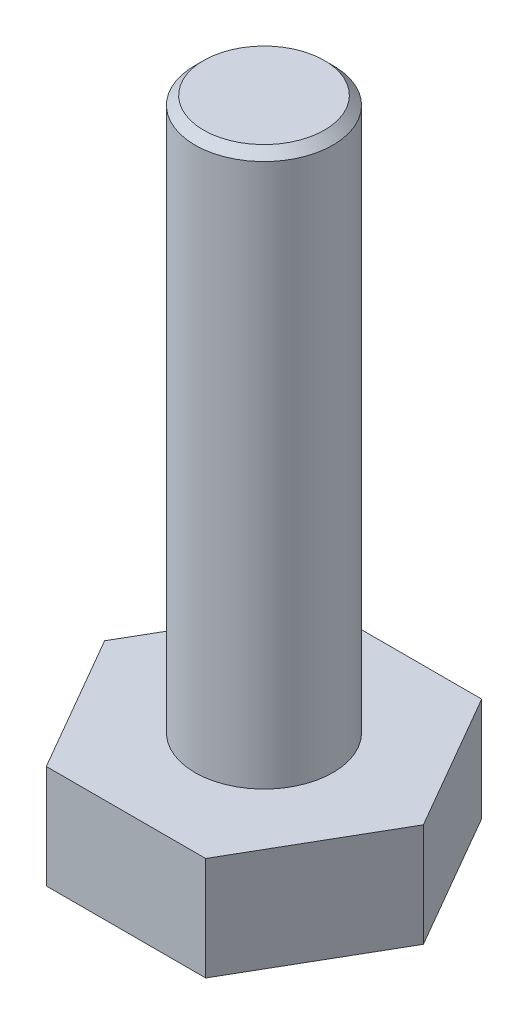
ISO-10303-21;
HEADER;
FILE_DESCRIPTION(('STEP AP214'),'2;1');
FILE_NAME('part.step','',(''),(''),'','','');
FILE_SCHEMA(('AUTOMOTIVE_DESIGN { 1 0 10303 214 1 1 1 1 }'));
ENDSEC;
DATA;
#1=APPLICATION_CONTEXT('core data for automotive mechanical design processes');
#2=APPLICATION_PROTOCOL_DEFINITION('international standard','automotive_design',2000,#1);
#3=PRODUCT_CONTEXT('',#1,'mechanical');
#4=PRODUCT('Part','Part','',(#3));
#5=PRODUCT_RELATED_PRODUCT_CATEGORY('part','',(#4));
#6=PRODUCT_DEFINITION_FORMATION('','',#4);
#7=PRODUCT_DEFINITION_CONTEXT('part definition',#1,'design');
#8=PRODUCT_DEFINITION('design','',#6,#7);
#9=PRODUCT_DEFINITION_SHAPE('','',#8);
#10=(LENGTH_UNIT() NAMED_UNIT(*) SI_UNIT(.MILLI.,.METRE.));
#11=(NAMED_UNIT(*) PLANE_ANGLE_UNIT() SI_UNIT($,.RADIAN.));
#12=(NAMED_UNIT(*) SI_UNIT($,.STERADIAN.) SOLID_ANGLE_UNIT());
#13=UNCERTAINTY_MEASURE_WITH_UNIT(LENGTH_MEASURE(1.E-05),#10,'distance_accuracy_value','');
#14=(GEOMETRIC_REPRESENTATION_CONTEXT(3) GLOBAL_UNCERTAINTY_ASSIGNED_CONTEXT((#13)) GLOBAL_UNIT_ASSIGNED_CONTEXT((#10,
#11,#12)) REPRESENTATION_CONTEXT('',''));
#15=CARTESIAN_POINT('',(0.,0.,0.));
#16=DIRECTION('',(0.,0.,1.));
#17=DIRECTION('',(1.,0.,0.));
#18=AXIS2_PLACEMENT_3D('',#15,#16,#17);
#19=CARTESIAN_POINT('',(2.30940107675854,-3.,3.99999999999996));
#20=DIRECTION('',(0.866025403784441,0.,0.499999999999995));
#21=DIRECTION('',(0.499999999999995,0.,-0.866025403784442));
#22=AXIS2_PLACEMENT_3D('',#19,#20,#21);
#23=PLANE('',#22);
#24=DIRECTION('',(0.499999999999995,0.,-0.866025403784442));
#25=VECTOR('',#24,1.);
#26=CARTESIAN_POINT('',(2.30940107675854,0.,3.99999999999996));
#27=LINE('',#26,#25);
#28=CARTESIAN_POINT('',(2.30940107675854,0.,3.99999999999996));
#29=VERTEX_POINT('',#28);
#30=CARTESIAN_POINT('',(4.61880215351699,0.,0.));
#31=VERTEX_POINT('',#30);
#32=EDGE_CURVE('E120',#29,#31,#27,.T.);
#33=ORIENTED_EDGE('',*,*,#32,.F.);
#34=DIRECTION('',(0.,1.,0.));
#35=VECTOR('',#34,1.);
#36=CARTESIAN_POINT('',(2.30940107675854,-3.,3.99999999999996));
#37=LINE('',#36,#35);
#38=CARTESIAN_POINT('',(2.30940107675854,-3.,3.99999999999996));
#39=VERTEX_POINT('',#38);
#40=EDGE_CURVE('E49',#39,#29,#37,.T.);
#41=ORIENTED_EDGE('',*,*,#40,.F.);
#42=DIRECTION('',(0.499999999999995,0.,-0.866025403784442));
#43=VECTOR('',#42,1.);
#44=CARTESIAN_POINT('',(2.30940107675854,-3.,3.99999999999996));
#45=LINE('',#44,#43);
#46=CARTESIAN_POINT('',(4.61880215351699,-3.,0.));
#47=VERTEX_POINT('',#46);
#48=EDGE_CURVE('E136',#39,#47,#45,.T.);
#49=ORIENTED_EDGE('',*,*,#48,.T.);
#50=DIRECTION('',(0.,1.,0.));
#51=VECTOR('',#50,1.);
#52=CARTESIAN_POINT('',(4.61880215351699,-3.,0.));
#53=LINE('',#52,#51);
#54=EDGE_CURVE('E84',#47,#31,#53,.T.);
#55=ORIENTED_EDGE('',*,*,#54,.T.);
#56=EDGE_LOOP('',(#33,#41,#49,#55));
#57=FACE_BOUND('',#56,.T.);
#58=ADVANCED_FACE('F32',(#57),#23,.T.);
#59=CARTESIAN_POINT('',(-2.30940107675846,-3.,4.00000000000001));
#60=DIRECTION('',(0.,0.,1.));
#61=DIRECTION('',(1.,0.,0.));
#62=AXIS2_PLACEMENT_3D('',#59,#60,#61);
#63=PLANE('',#62);
#64=DIRECTION('',(1.,0.,0.));
#65=VECTOR('',#64,1.);
#66=CARTESIAN_POINT('',(-2.30940107675846,0.,4.00000000000001));
#67=LINE('',#66,#65);
#68=CARTESIAN_POINT('',(-2.30940107675846,0.,4.00000000000001));
#69=VERTEX_POINT('',#68);
#70=EDGE_CURVE('E133',#69,#29,#67,.T.);
#71=ORIENTED_EDGE('',*,*,#70,.F.);
#72=DIRECTION('',(0.,1.,0.));
#73=VECTOR('',#72,1.);
#74=CARTESIAN_POINT('',(-2.30940107675846,-3.,4.00000000000001));
#75=LINE('',#74,#73);
#76=CARTESIAN_POINT('',(-2.30940107675846,-3.,4.00000000000001));
#77=VERTEX_POINT('',#76);
#78=EDGE_CURVE('E72',#77,#69,#75,.T.);
#79=ORIENTED_EDGE('',*,*,#78,.F.);
#80=DIRECTION('',(1.,0.,0.));
#81=VECTOR('',#80,1.);
#82=CARTESIAN_POINT('',(-2.30940107675846,-3.,4.00000000000001));
#83=LINE('',#82,#81);
#84=EDGE_CURVE('E110',#77,#39,#83,.T.);
#85=ORIENTED_EDGE('',*,*,#84,.T.);
#86=ORIENTED_EDGE('',*,*,#40,.T.);
#87=EDGE_LOOP('',(#71,#79,#85,#86));
#88=FACE_BOUND('',#87,.T.);
#89=ADVANCED_FACE('F156',(#88),#63,.T.);
#90=CARTESIAN_POINT('',(-4.61880215351699,-3.,0.));
#91=DIRECTION('',(-0.866025403784434,0.,0.500000000000007));
#92=DIRECTION('',(0.500000000000007,0.,0.866025403784435));
#93=AXIS2_PLACEMENT_3D('',#90,#91,#92);
#94=PLANE('',#93);
#95=DIRECTION('',(0.500000000000007,0.,0.866025403784435));
#96=VECTOR('',#95,1.);
#97=CARTESIAN_POINT('',(-4.61880215351699,0.,0.));
#98=LINE('',#97,#96);
#99=CARTESIAN_POINT('',(-4.61880215351699,0.,0.));
#100=VERTEX_POINT('',#99);
#101=EDGE_CURVE('E97',#100,#69,#98,.T.);
#102=ORIENTED_EDGE('',*,*,#101,.F.);
#103=DIRECTION('',(0.,1.,0.));
#104=VECTOR('',#103,1.);
#105=CARTESIAN_POINT('',(-4.61880215351699,-3.,0.));
#106=LINE('',#105,#104);
#107=CARTESIAN_POINT('',(-4.61880215351699,-3.,0.));
#108=VERTEX_POINT('',#107);
#109=EDGE_CURVE('E92',#108,#100,#106,.T.);
#110=ORIENTED_EDGE('',*,*,#109,.F.);
#111=DIRECTION('',(0.500000000000007,0.,0.866025403784435));
#112=VECTOR('',#111,1.);
#113=CARTESIAN_POINT('',(-4.61880215351699,-3.,0.));
#114=LINE('',#113,#112);
#115=EDGE_CURVE('E95',#108,#77,#114,.T.);
#116=ORIENTED_EDGE('',*,*,#115,.T.);
#117=ORIENTED_EDGE('',*,*,#78,.T.);
#118=EDGE_LOOP('',(#102,#110,#116,#117));
#119=FACE_BOUND('',#118,.T.);
#120=ADVANCED_FACE('F94',(#119),#94,.T.);
#121=CARTESIAN_POINT('',(-2.30940107675851,-3.,-3.99999999999998));
#122=DIRECTION('',(-0.866025403784441,0.,-0.499999999999995));
#123=DIRECTION('',(-0.499999999999995,0.,0.866025403784442));
#124=AXIS2_PLACEMENT_3D('',#121,#122,#123);
#125=PLANE('',#124);
#126=DIRECTION('',(-0.499999999999995,0.,0.866025403784442));
#127=VECTOR('',#126,1.);
#128=CARTESIAN_POINT('',(-2.30940107675851,0.,-3.99999999999998));
#129=LINE('',#128,#127);
#130=CARTESIAN_POINT('',(-2.30940107675851,0.,-3.99999999999998));
#131=VERTEX_POINT('',#130);
#132=EDGE_CURVE('E130',#131,#100,#129,.T.);
#133=ORIENTED_EDGE('',*,*,#132,.F.);
#134=DIRECTION('',(0.,1.,0.));
#135=VECTOR('',#134,1.);
#136=CARTESIAN_POINT('',(-2.30940107675851,-3.,-3.99999999999998));
#137=LINE('',#136,#135);
#138=CARTESIAN_POINT('',(-2.30940107675851,-3.,-3.99999999999998));
#139=VERTEX_POINT('',#138);
#140=EDGE_CURVE('E102',#139,#131,#137,.T.);
#141=ORIENTED_EDGE('',*,*,#140,.F.);
#142=DIRECTION('',(-0.499999999999995,0.,0.866025403784442));
#143=VECTOR('',#142,1.);
#144=CARTESIAN_POINT('',(-2.30940107675851,-3.,-3.99999999999998));
#145=LINE('',#144,#143);
#146=EDGE_CURVE('E108',#139,#108,#145,.T.);
#147=ORIENTED_EDGE('',*,*,#146,.T.);
#148=ORIENTED_EDGE('',*,*,#109,.T.);
#149=EDGE_LOOP('',(#133,#141,#147,#148));
#150=FACE_BOUND('',#149,.T.);
#151=ADVANCED_FACE('F112',(#150),#125,.T.);
#152=CARTESIAN_POINT('',(2.30940107675849,-3.,-3.99999999999999));
#153=DIRECTION('',(0.,0.,-1.));
#154=DIRECTION('',(-1.,0.,0.));
#155=AXIS2_PLACEMENT_3D('',#152,#153,#154);
#156=PLANE('',#155);
#157=DIRECTION('',(-1.,0.,0.));
#158=VECTOR('',#157,1.);
#159=CARTESIAN_POINT('',(2.30940107675849,0.,-3.99999999999999));
#160=LINE('',#159,#158);
#161=CARTESIAN_POINT('',(2.30940107675849,0.,-3.99999999999999));
#162=VERTEX_POINT('',#161);
#163=EDGE_CURVE('E127',#162,#131,#160,.T.);
#164=ORIENTED_EDGE('',*,*,#163,.F.);
#165=DIRECTION('',(0.,1.,0.));
#166=VECTOR('',#165,1.);
#167=CARTESIAN_POINT('',(2.30940107675849,-3.,-3.99999999999999));
#168=LINE('',#167,#166);
#169=CARTESIAN_POINT('',(2.30940107675849,-3.,-3.99999999999999));
#170=VERTEX_POINT('',#169);
#171=EDGE_CURVE('E140',#170,#162,#168,.T.);
#172=ORIENTED_EDGE('',*,*,#171,.F.);
#173=DIRECTION('',(-1.,0.,0.));
#174=VECTOR('',#173,1.);
#175=CARTESIAN_POINT('',(2.30940107675849,-3.,-3.99999999999999));
#176=LINE('',#175,#174);
#177=EDGE_CURVE('E113',#170,#139,#176,.T.);
#178=ORIENTED_EDGE('',*,*,#177,.T.);
#179=ORIENTED_EDGE('',*,*,#140,.T.);
#180=EDGE_LOOP('',(#164,#172,#178,#179));
#181=FACE_BOUND('',#180,.T.);
#182=ADVANCED_FACE('F165',(#181),#156,.T.);
#183=CARTESIAN_POINT('',(4.61880215351699,-3.,0.));
#184=DIRECTION('',(0.866025403784438,0.,-0.500000000000001));
#185=DIRECTION('',(-0.500000000000001,0.,-0.866025403784438));
#186=AXIS2_PLACEMENT_3D('',#183,#184,#185);
#187=PLANE('',#186);
#188=DIRECTION('',(-0.500000000000001,0.,-0.866025403784438));
#189=VECTOR('',#188,1.);
#190=CARTESIAN_POINT('',(4.61880215351699,0.,0.));
#191=LINE('',#190,#189);
#192=EDGE_CURVE('E123',#31,#162,#191,.T.);
#193=ORIENTED_EDGE('',*,*,#192,.F.);
#194=ORIENTED_EDGE('',*,*,#54,.F.);
#195=DIRECTION('',(-0.500000000000001,0.,-0.866025403784438));
#196=VECTOR('',#195,1.);
#197=CARTESIAN_POINT('',(4.61880215351699,-3.,0.));
#198=LINE('',#197,#196);
#199=EDGE_CURVE('E115',#47,#170,#198,.T.);
#200=ORIENTED_EDGE('',*,*,#199,.T.);
#201=ORIENTED_EDGE('',*,*,#171,.T.);
#202=EDGE_LOOP('',(#193,#194,#200,#201));
#203=FACE_BOUND('',#202,.T.);
#204=ADVANCED_FACE('F162',(#203),#187,.T.);
#205=CARTESIAN_POINT('',(0.,-3.,0.));
#206=DIRECTION('',(0.,1.,0.));
#207=DIRECTION('',(0.,0.,1.));
#208=AXIS2_PLACEMENT_3D('',#205,#206,#207);
#209=PLANE('',#208);
#210=ORIENTED_EDGE('',*,*,#48,.F.);
#211=ORIENTED_EDGE('',*,*,#84,.F.);
#212=ORIENTED_EDGE('',*,*,#115,.F.);
#213=ORIENTED_EDGE('',*,*,#146,.F.);
#214=ORIENTED_EDGE('',*,*,#177,.F.);
#215=ORIENTED_EDGE('',*,*,#199,.F.);
#216=EDGE_LOOP('',(#210,#211,#212,#213,#214,#215));
#217=FACE_BOUND('',#216,.T.);
#218=ADVANCED_FACE('F106',(#217),#209,.F.);
#219=CARTESIAN_POINT('',(0.,0.,0.));
#220=DIRECTION('',(0.,1.,0.));
#221=DIRECTION('',(0.,0.,1.));
#222=AXIS2_PLACEMENT_3D('',#219,#220,#221);
#223=PLANE('',#222);
#224=CARTESIAN_POINT('',(0.,0.,0.));
#225=DIRECTION('',(0.,1.,0.));
#226=DIRECTION('',(0.,0.,1.));
#227=AXIS2_PLACEMENT_3D('',#224,#225,#226);
#228=CIRCLE('',#227,2.);
#229=CARTESIAN_POINT('',(0.,0.,2.));
#230=VERTEX_POINT('',#229);
#231=EDGE_CURVE('E124',#230,#230,#228,.T.);
#232=ORIENTED_EDGE('',*,*,#231,.F.);
#233=EDGE_LOOP('',(#232));
#234=FACE_BOUND('',#233,.T.);
#235=ORIENTED_EDGE('',*,*,#32,.T.);
#236=ORIENTED_EDGE('',*,*,#192,.T.);
#237=ORIENTED_EDGE('',*,*,#163,.T.);
#238=ORIENTED_EDGE('',*,*,#132,.T.);
#239=ORIENTED_EDGE('',*,*,#101,.T.);
#240=ORIENTED_EDGE('',*,*,#70,.T.);
#241=EDGE_LOOP('',(#235,#236,#237,#238,#239,#240));
#242=FACE_BOUND('',#241,.T.);
#243=ADVANCED_FACE('F173',(#234,#242),#223,.T.);
#244=CARTESIAN_POINT('',(0.,16.,0.));
#245=DIRECTION('',(0.,-1.,0.));
#246=DIRECTION('',(0.,0.,-1.));
#247=AXIS2_PLACEMENT_3D('',#244,#245,#246);
#248=CYLINDRICAL_SURFACE('',#247,2.);
#249=CARTESIAN_POINT('',(0.,15.75,0.));
#250=DIRECTION('',(0.,1.,0.));
#251=DIRECTION('',(0.,0.,1.));
#252=AXIS2_PLACEMENT_3D('',#249,#250,#251);
#253=CIRCLE('',#252,2.);
#254=CARTESIAN_POINT('',(0.,15.75,2.));
#255=VERTEX_POINT('',#254);
#256=EDGE_CURVE('E11',#255,#255,#253,.F.);
#257=ORIENTED_EDGE('',*,*,#256,.T.);
#258=EDGE_LOOP('',(#257));
#259=FACE_BOUND('',#258,.T.);
#260=ORIENTED_EDGE('',*,*,#231,.T.);
#261=EDGE_LOOP('',(#260));
#262=FACE_BOUND('',#261,.T.);
#263=ADVANCED_FACE('F152',(#259,#262),#248,.T.);
#264=CARTESIAN_POINT('',(0.,16.,0.));
#265=DIRECTION('',(0.,1.,0.));
#266=DIRECTION('',(0.,0.,1.));
#267=AXIS2_PLACEMENT_3D('',#264,#265,#266);
#268=PLANE('',#267);
#269=CARTESIAN_POINT('',(0.,16.,0.));
#270=DIRECTION('',(0.,1.,0.));
#271=DIRECTION('',(0.,0.,1.));
#272=AXIS2_PLACEMENT_3D('',#269,#270,#271);
#273=CIRCLE('',#272,1.75);
#274=CARTESIAN_POINT('',(0.,16.,1.75));
#275=VERTEX_POINT('',#274);
#276=EDGE_CURVE('E41',#275,#275,#273,.T.);
#277=ORIENTED_EDGE('',*,*,#276,.T.);
#278=EDGE_LOOP('',(#277));
#279=FACE_BOUND('',#278,.T.);
#280=ADVANCED_FACE('F145',(#279),#268,.T.);
#281=CARTESIAN_POINT('',(0.,16.,0.));
#282=DIRECTION('',(0.,-1.,0.));
#283=DIRECTION('',(0.,0.,-1.));
#284=AXIS2_PLACEMENT_3D('',#281,#282,#283);
#285=CONICAL_SURFACE('',#284,1.75,0.785398163397452);
#286=ORIENTED_EDGE('',*,*,#256,.F.);
#287=EDGE_LOOP('',(#286));
#288=FACE_BOUND('',#287,.T.);
#289=ORIENTED_EDGE('',*,*,#276,.F.);
#290=EDGE_LOOP('',(#289));
#291=FACE_BOUND('',#290,.T.);
#292=ADVANCED_FACE('F34',(#288,#291),#285,.T.);
#293=CLOSED_SHELL('',(#58,#89,#120,#151,#182,#204,#218,#243,#263,#280,#292));
#294=MANIFOLD_SOLID_BREP('B2',#293);
#295=ADVANCED_BREP_SHAPE_REPRESENTATION('',(#18,#294),#14);
#296=SHAPE_DEFINITION_REPRESENTATION(#9,#295);
ENDSEC;
END-ISO-10303-21;
